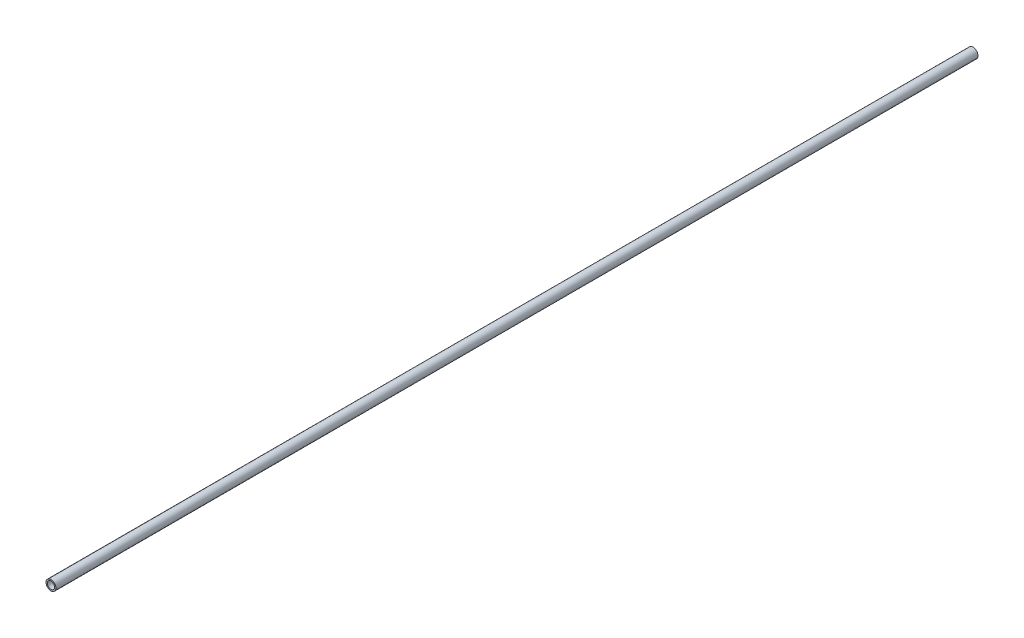
ISO-10303-21;
HEADER;
FILE_DESCRIPTION(('STEP AP214'),'2;1');
FILE_NAME('part.step','',(''),(''),'','','');
FILE_SCHEMA(('AUTOMOTIVE_DESIGN { 1 0 10303 214 1 1 1 1 }'));
ENDSEC;
DATA;
#1=APPLICATION_CONTEXT('core data for automotive mechanical design processes');
#2=APPLICATION_PROTOCOL_DEFINITION('international standard','automotive_design',2000,#1);
#3=PRODUCT_CONTEXT('',#1,'mechanical');
#4=PRODUCT('Part','Part','',(#3));
#5=PRODUCT_RELATED_PRODUCT_CATEGORY('part','',(#4));
#6=PRODUCT_DEFINITION_FORMATION('','',#4);
#7=PRODUCT_DEFINITION_CONTEXT('part definition',#1,'design');
#8=PRODUCT_DEFINITION('design','',#6,#7);
#9=PRODUCT_DEFINITION_SHAPE('','',#8);
#10=(LENGTH_UNIT() NAMED_UNIT(*) SI_UNIT(.MILLI.,.METRE.));
#11=(NAMED_UNIT(*) PLANE_ANGLE_UNIT() SI_UNIT($,.RADIAN.));
#12=(NAMED_UNIT(*) SI_UNIT($,.STERADIAN.) SOLID_ANGLE_UNIT());
#13=UNCERTAINTY_MEASURE_WITH_UNIT(LENGTH_MEASURE(1.E-05),#10,'distance_accuracy_value','');
#14=(GEOMETRIC_REPRESENTATION_CONTEXT(3) GLOBAL_UNCERTAINTY_ASSIGNED_CONTEXT((#13)) GLOBAL_UNIT_ASSIGNED_CONTEXT((#10,
#11,#12)) REPRESENTATION_CONTEXT('',''));
#15=CARTESIAN_POINT('',(0.,0.,0.));
#16=DIRECTION('',(0.,0.,1.));
#17=DIRECTION('',(1.,0.,0.));
#18=AXIS2_PLACEMENT_3D('',#15,#16,#17);
#19=CARTESIAN_POINT('',(0.,0.,0.));
#20=DIRECTION('',(0.,0.,-1.));
#21=DIRECTION('',(0.,-1.,0.));
#22=AXIS2_PLACEMENT_3D('',#19,#20,#21);
#23=CYLINDRICAL_SURFACE('',#22,6.2611);
#24=CARTESIAN_POINT('',(0.,0.,-1593.85));
#25=DIRECTION('',(0.,0.,1.));
#26=DIRECTION('',(1.,0.,0.));
#27=AXIS2_PLACEMENT_3D('',#24,#25,#26);
#28=CIRCLE('',#27,6.2611);
#29=CARTESIAN_POINT('',(6.2611,0.,-1593.85));
#30=VERTEX_POINT('',#29);
#31=EDGE_CURVE('E25',#30,#30,#28,.T.);
#32=ORIENTED_EDGE('',*,*,#31,.F.);
#33=EDGE_LOOP('',(#32));
#34=FACE_BOUND('',#33,.T.);
#35=CARTESIAN_POINT('',(0.,0.,0.));
#36=DIRECTION('',(0.,0.,-1.));
#37=DIRECTION('',(0.,-1.,0.));
#38=AXIS2_PLACEMENT_3D('',#35,#36,#37);
#39=CIRCLE('',#38,6.2611);
#40=CARTESIAN_POINT('',(0.,-6.2611,0.));
#41=VERTEX_POINT('',#40);
#42=EDGE_CURVE('E29',#41,#41,#39,.T.);
#43=ORIENTED_EDGE('',*,*,#42,.F.);
#44=EDGE_LOOP('',(#43));
#45=FACE_BOUND('',#44,.T.);
#46=ADVANCED_FACE('F14',(#34,#45),#23,.F.);
#47=CARTESIAN_POINT('',(0.,0.,0.));
#48=DIRECTION('',(0.,0.,-1.));
#49=DIRECTION('',(0.,-1.,0.));
#50=AXIS2_PLACEMENT_3D('',#47,#48,#49);
#51=CYLINDRICAL_SURFACE('',#50,8.5725);
#52=CARTESIAN_POINT('',(0.,0.,-1593.85));
#53=DIRECTION('',(0.,0.,-1.));
#54=DIRECTION('',(0.,-1.,0.));
#55=AXIS2_PLACEMENT_3D('',#52,#53,#54);
#56=CIRCLE('',#55,8.5725);
#57=CARTESIAN_POINT('',(0.,-8.5725,-1593.85));
#58=VERTEX_POINT('',#57);
#59=EDGE_CURVE('E21',#58,#58,#56,.T.);
#60=ORIENTED_EDGE('',*,*,#59,.F.);
#61=EDGE_LOOP('',(#60));
#62=FACE_BOUND('',#61,.T.);
#63=CARTESIAN_POINT('',(0.,0.,0.));
#64=DIRECTION('',(0.,0.,-1.));
#65=DIRECTION('',(0.,-1.,0.));
#66=AXIS2_PLACEMENT_3D('',#63,#64,#65);
#67=CIRCLE('',#66,8.5725);
#68=CARTESIAN_POINT('',(0.,-8.5725,0.));
#69=VERTEX_POINT('',#68);
#70=EDGE_CURVE('E9',#69,#69,#67,.T.);
#71=ORIENTED_EDGE('',*,*,#70,.T.);
#72=EDGE_LOOP('',(#71));
#73=FACE_BOUND('',#72,.T.);
#74=ADVANCED_FACE('F16',(#62,#73),#51,.T.);
#75=CARTESIAN_POINT('',(0.,0.,-1593.85));
#76=DIRECTION('',(0.,0.,1.));
#77=DIRECTION('',(1.,0.,0.));
#78=AXIS2_PLACEMENT_3D('',#75,#76,#77);
#79=PLANE('',#78);
#80=ORIENTED_EDGE('',*,*,#59,.T.);
#81=EDGE_LOOP('',(#80));
#82=FACE_BOUND('',#81,.T.);
#83=ORIENTED_EDGE('',*,*,#31,.T.);
#84=EDGE_LOOP('',(#83));
#85=FACE_BOUND('',#84,.T.);
#86=ADVANCED_FACE('F43',(#82,#85),#79,.F.);
#87=CARTESIAN_POINT('',(0.,0.,0.));
#88=DIRECTION('',(0.,0.,1.));
#89=DIRECTION('',(1.,0.,0.));
#90=AXIS2_PLACEMENT_3D('',#87,#88,#89);
#91=PLANE('',#90);
#92=ORIENTED_EDGE('',*,*,#70,.F.);
#93=EDGE_LOOP('',(#92));
#94=FACE_BOUND('',#93,.T.);
#95=ORIENTED_EDGE('',*,*,#42,.T.);
#96=EDGE_LOOP('',(#95));
#97=FACE_BOUND('',#96,.T.);
#98=ADVANCED_FACE('F35',(#94,#97),#91,.T.);
#99=CLOSED_SHELL('',(#46,#74,#86,#98));
#100=MANIFOLD_SOLID_BREP('B1',#99);
#101=ADVANCED_BREP_SHAPE_REPRESENTATION('',(#18,#100),#14);
#102=SHAPE_DEFINITION_REPRESENTATION(#9,#101);
ENDSEC;
END-ISO-10303-21;
